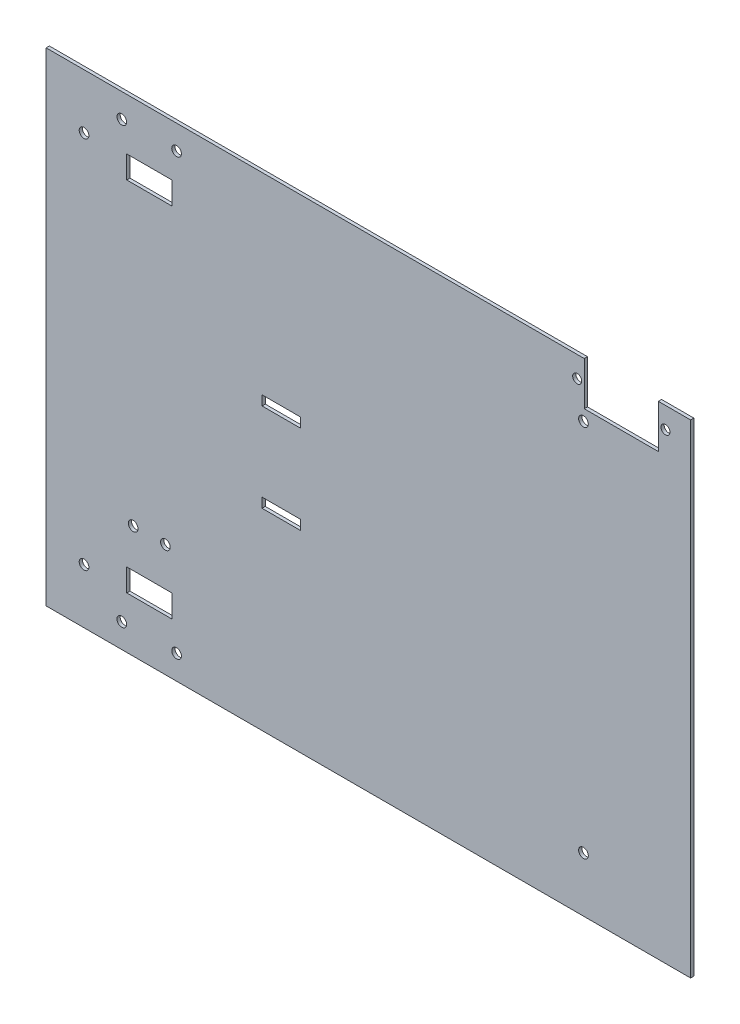
ISO-10303-21;
HEADER;
FILE_DESCRIPTION(('STEP AP214'),'2;1');
FILE_NAME('part.step','',(''),(''),'','','');
FILE_SCHEMA(('AUTOMOTIVE_DESIGN { 1 0 10303 214 1 1 1 1 }'));
ENDSEC;
DATA;
#1=APPLICATION_CONTEXT('core data for automotive mechanical design processes');
#2=APPLICATION_PROTOCOL_DEFINITION('international standard','automotive_design',2000,#1);
#3=PRODUCT_CONTEXT('',#1,'mechanical');
#4=PRODUCT('Part','Part','',(#3));
#5=PRODUCT_RELATED_PRODUCT_CATEGORY('part','',(#4));
#6=PRODUCT_DEFINITION_FORMATION('','',#4);
#7=PRODUCT_DEFINITION_CONTEXT('part definition',#1,'design');
#8=PRODUCT_DEFINITION('design','',#6,#7);
#9=PRODUCT_DEFINITION_SHAPE('','',#8);
#10=(LENGTH_UNIT() NAMED_UNIT(*) SI_UNIT(.MILLI.,.METRE.));
#11=(NAMED_UNIT(*) PLANE_ANGLE_UNIT() SI_UNIT($,.RADIAN.));
#12=(NAMED_UNIT(*) SI_UNIT($,.STERADIAN.) SOLID_ANGLE_UNIT());
#13=UNCERTAINTY_MEASURE_WITH_UNIT(LENGTH_MEASURE(1.E-05),#10,'distance_accuracy_value','');
#14=(GEOMETRIC_REPRESENTATION_CONTEXT(3) GLOBAL_UNCERTAINTY_ASSIGNED_CONTEXT((#13)) GLOBAL_UNIT_ASSIGNED_CONTEXT((#10,
#11,#12)) REPRESENTATION_CONTEXT('',''));
#15=CARTESIAN_POINT('',(0.,0.,0.));
#16=DIRECTION('',(0.,0.,1.));
#17=DIRECTION('',(1.,0.,0.));
#18=AXIS2_PLACEMENT_3D('',#15,#16,#17);
#19=CARTESIAN_POINT('',(-100.,75.,1.));
#20=DIRECTION('',(0.,-1.,0.));
#21=DIRECTION('',(0.,0.,-1.));
#22=AXIS2_PLACEMENT_3D('',#19,#20,#21);
#23=PLANE('',#22);
#24=DIRECTION('',(-1.,0.,0.));
#25=VECTOR('',#24,1.);
#26=CARTESIAN_POINT('',(-100.,75.,1.));
#27=LINE('',#26,#25);
#28=CARTESIAN_POINT('',(67.,75.,1.));
#29=VERTEX_POINT('',#28);
#30=CARTESIAN_POINT('',(-100.,75.,1.));
#31=VERTEX_POINT('',#30);
#32=EDGE_CURVE('E421',#29,#31,#27,.T.);
#33=ORIENTED_EDGE('',*,*,#32,.F.);
#34=DIRECTION('',(0.,0.,1.));
#35=VECTOR('',#34,1.);
#36=CARTESIAN_POINT('',(67.,75.,0.));
#37=LINE('',#36,#35);
#38=CARTESIAN_POINT('',(67.,75.,0.));
#39=VERTEX_POINT('',#38);
#40=EDGE_CURVE('E228',#39,#29,#37,.T.);
#41=ORIENTED_EDGE('',*,*,#40,.F.);
#42=DIRECTION('',(-1.,0.,0.));
#43=VECTOR('',#42,1.);
#44=CARTESIAN_POINT('',(-100.,75.,0.));
#45=LINE('',#44,#43);
#46=CARTESIAN_POINT('',(-100.,75.,0.));
#47=VERTEX_POINT('',#46);
#48=EDGE_CURVE('E433',#39,#47,#45,.T.);
#49=ORIENTED_EDGE('',*,*,#48,.T.);
#50=DIRECTION('',(0.,0.,-1.));
#51=VECTOR('',#50,1.);
#52=CARTESIAN_POINT('',(-100.,75.,1.));
#53=LINE('',#52,#51);
#54=EDGE_CURVE('E41',#31,#47,#53,.T.);
#55=ORIENTED_EDGE('',*,*,#54,.F.);
#56=EDGE_LOOP('',(#33,#41,#49,#55));
#57=FACE_BOUND('',#56,.T.);
#58=ADVANCED_FACE('F33',(#57),#23,.F.);
#59=CARTESIAN_POINT('',(100.,75.,1.));
#60=DIRECTION('',(-1.,0.,0.));
#61=DIRECTION('',(0.,-1.,0.));
#62=AXIS2_PLACEMENT_3D('',#59,#60,#61);
#63=PLANE('',#62);
#64=DIRECTION('',(0.,1.,0.));
#65=VECTOR('',#64,1.);
#66=CARTESIAN_POINT('',(100.,75.,0.));
#67=LINE('',#66,#65);
#68=CARTESIAN_POINT('',(100.,-75.,0.));
#69=VERTEX_POINT('',#68);
#70=CARTESIAN_POINT('',(100.,75.,0.));
#71=VERTEX_POINT('',#70);
#72=EDGE_CURVE('E411',#69,#71,#67,.T.);
#73=ORIENTED_EDGE('',*,*,#72,.T.);
#74=DIRECTION('',(0.,0.,-1.));
#75=VECTOR('',#74,1.);
#76=CARTESIAN_POINT('',(100.,75.,1.));
#77=LINE('',#76,#75);
#78=CARTESIAN_POINT('',(100.,75.,1.));
#79=VERTEX_POINT('',#78);
#80=EDGE_CURVE('E11',#79,#71,#77,.T.);
#81=ORIENTED_EDGE('',*,*,#80,.F.);
#82=DIRECTION('',(0.,1.,0.));
#83=VECTOR('',#82,1.);
#84=CARTESIAN_POINT('',(100.,75.,1.));
#85=LINE('',#84,#83);
#86=CARTESIAN_POINT('',(100.,-75.,1.));
#87=VERTEX_POINT('',#86);
#88=EDGE_CURVE('E418',#87,#79,#85,.T.);
#89=ORIENTED_EDGE('',*,*,#88,.F.);
#90=DIRECTION('',(0.,0.,-1.));
#91=VECTOR('',#90,1.);
#92=CARTESIAN_POINT('',(100.,-75.,1.));
#93=LINE('',#92,#91);
#94=EDGE_CURVE('E430',#87,#69,#93,.T.);
#95=ORIENTED_EDGE('',*,*,#94,.T.);
#96=EDGE_LOOP('',(#73,#81,#89,#95));
#97=FACE_BOUND('',#96,.T.);
#98=ADVANCED_FACE('F35',(#97),#63,.F.);
#99=CARTESIAN_POINT('',(90.,75.,0.));
#100=VERTEX_POINT('',#99);
#101=EDGE_CURVE('E434',#71,#100,#45,.T.);
#102=ORIENTED_EDGE('',*,*,#101,.T.);
#103=DIRECTION('',(0.,0.,1.));
#104=VECTOR('',#103,1.);
#105=CARTESIAN_POINT('',(90.,75.,0.));
#106=LINE('',#105,#104);
#107=CARTESIAN_POINT('',(90.,75.,1.));
#108=VERTEX_POINT('',#107);
#109=EDGE_CURVE('E258',#100,#108,#106,.T.);
#110=ORIENTED_EDGE('',*,*,#109,.T.);
#111=EDGE_CURVE('E423',#79,#108,#27,.T.);
#112=ORIENTED_EDGE('',*,*,#111,.F.);
#113=ORIENTED_EDGE('',*,*,#80,.T.);
#114=EDGE_LOOP('',(#102,#110,#112,#113));
#115=FACE_BOUND('',#114,.T.);
#116=ADVANCED_FACE('F480',(#115),#23,.F.);
#117=CARTESIAN_POINT('',(-100.,75.,1.));
#118=DIRECTION('',(1.,0.,0.));
#119=DIRECTION('',(0.,1.,0.));
#120=AXIS2_PLACEMENT_3D('',#117,#118,#119);
#121=PLANE('',#120);
#122=DIRECTION('',(0.,-1.,0.));
#123=VECTOR('',#122,1.);
#124=CARTESIAN_POINT('',(-100.,75.,0.));
#125=LINE('',#124,#123);
#126=CARTESIAN_POINT('',(-99.9999999999999,-75.,0.));
#127=VERTEX_POINT('',#126);
#128=EDGE_CURVE('E437',#47,#127,#125,.T.);
#129=ORIENTED_EDGE('',*,*,#128,.T.);
#130=DIRECTION('',(0.,0.,-1.));
#131=VECTOR('',#130,1.);
#132=CARTESIAN_POINT('',(-99.9999999999999,-75.,1.));
#133=LINE('',#132,#131);
#134=CARTESIAN_POINT('',(-99.9999999999999,-75.,1.));
#135=VERTEX_POINT('',#134);
#136=EDGE_CURVE('E442',#135,#127,#133,.T.);
#137=ORIENTED_EDGE('',*,*,#136,.F.);
#138=DIRECTION('',(0.,-1.,0.));
#139=VECTOR('',#138,1.);
#140=CARTESIAN_POINT('',(-100.,75.,1.));
#141=LINE('',#140,#139);
#142=EDGE_CURVE('E426',#31,#135,#141,.T.);
#143=ORIENTED_EDGE('',*,*,#142,.F.);
#144=ORIENTED_EDGE('',*,*,#54,.T.);
#145=EDGE_LOOP('',(#129,#137,#143,#144));
#146=FACE_BOUND('',#145,.T.);
#147=ADVANCED_FACE('F449',(#146),#121,.F.);
#148=CARTESIAN_POINT('',(-99.9999999999999,-75.,1.));
#149=DIRECTION('',(0.,1.,0.));
#150=DIRECTION('',(0.,0.,1.));
#151=AXIS2_PLACEMENT_3D('',#148,#149,#150);
#152=PLANE('',#151);
#153=DIRECTION('',(1.,0.,0.));
#154=VECTOR('',#153,1.);
#155=CARTESIAN_POINT('',(-99.9999999999999,-75.,0.));
#156=LINE('',#155,#154);
#157=EDGE_CURVE('E422',#127,#69,#156,.T.);
#158=ORIENTED_EDGE('',*,*,#157,.T.);
#159=ORIENTED_EDGE('',*,*,#94,.F.);
#160=DIRECTION('',(1.,0.,0.));
#161=VECTOR('',#160,1.);
#162=CARTESIAN_POINT('',(-99.9999999999999,-75.,1.));
#163=LINE('',#162,#161);
#164=EDGE_CURVE('E428',#135,#87,#163,.T.);
#165=ORIENTED_EDGE('',*,*,#164,.F.);
#166=ORIENTED_EDGE('',*,*,#136,.T.);
#167=EDGE_LOOP('',(#158,#159,#165,#166));
#168=FACE_BOUND('',#167,.T.);
#169=ADVANCED_FACE('F459',(#168),#152,.F.);
#170=CARTESIAN_POINT('',(0.,0.,1.));
#171=DIRECTION('',(0.,0.,1.));
#172=DIRECTION('',(1.,0.,0.));
#173=AXIS2_PLACEMENT_3D('',#170,#171,#172);
#174=PLANE('',#173);
#175=CARTESIAN_POINT('',(-88.2534675197417,-58.,1.));
#176=DIRECTION('',(0.,0.,1.));
#177=DIRECTION('',(1.,0.,0.));
#178=AXIS2_PLACEMENT_3D('',#175,#176,#177);
#179=CIRCLE('',#178,1.5);
#180=CARTESIAN_POINT('',(-86.7534675197417,-58.,1.));
#181=VERTEX_POINT('',#180);
#182=EDGE_CURVE('E267',#181,#181,#179,.T.);
#183=ORIENTED_EDGE('',*,*,#182,.F.);
#184=EDGE_LOOP('',(#183));
#185=FACE_BOUND('',#184,.T.);
#186=CARTESIAN_POINT('',(-63.,-40.,1.));
#187=DIRECTION('',(0.,0.,1.));
#188=DIRECTION('',(1.,0.,0.));
#189=AXIS2_PLACEMENT_3D('',#186,#187,#188);
#190=CIRCLE('',#189,1.5);
#191=CARTESIAN_POINT('',(-61.5,-40.,1.));
#192=VERTEX_POINT('',#191);
#193=EDGE_CURVE('E354',#192,#192,#190,.T.);
#194=ORIENTED_EDGE('',*,*,#193,.F.);
#195=EDGE_LOOP('',(#194));
#196=FACE_BOUND('',#195,.T.);
#197=DIRECTION('',(0.,-1.,0.));
#198=VECTOR('',#197,1.);
#199=CARTESIAN_POINT('',(-75.,59.,1.));
#200=LINE('',#199,#198);
#201=CARTESIAN_POINT('',(-75.,59.,1.));
#202=VERTEX_POINT('',#201);
#203=CARTESIAN_POINT('',(-75.,52.,1.));
#204=VERTEX_POINT('',#203);
#205=EDGE_CURVE('E48',#202,#204,#200,.T.);
#206=ORIENTED_EDGE('',*,*,#205,.F.);
#207=DIRECTION('',(-1.,0.,0.));
#208=VECTOR('',#207,1.);
#209=CARTESIAN_POINT('',(-75.,59.,1.));
#210=LINE('',#209,#208);
#211=CARTESIAN_POINT('',(-61.,59.,1.));
#212=VERTEX_POINT('',#211);
#213=EDGE_CURVE('E326',#212,#202,#210,.T.);
#214=ORIENTED_EDGE('',*,*,#213,.F.);
#215=DIRECTION('',(0.,1.,0.));
#216=VECTOR('',#215,1.);
#217=CARTESIAN_POINT('',(-61.,59.,1.));
#218=LINE('',#217,#216);
#219=CARTESIAN_POINT('',(-61.,52.,1.));
#220=VERTEX_POINT('',#219);
#221=EDGE_CURVE('E341',#220,#212,#218,.T.);
#222=ORIENTED_EDGE('',*,*,#221,.F.);
#223=DIRECTION('',(1.,0.,0.));
#224=VECTOR('',#223,1.);
#225=CARTESIAN_POINT('',(-75.,52.,1.));
#226=LINE('',#225,#224);
#227=EDGE_CURVE('E337',#204,#220,#226,.T.);
#228=ORIENTED_EDGE('',*,*,#227,.F.);
#229=EDGE_LOOP('',(#206,#214,#222,#228));
#230=FACE_BOUND('',#229,.T.);
#231=CARTESIAN_POINT('',(-76.53,67.5,1.));
#232=DIRECTION('',(0.,0.,1.));
#233=DIRECTION('',(-1.,0.,0.));
#234=AXIS2_PLACEMENT_3D('',#231,#232,#233);
#235=CIRCLE('',#234,1.5);
#236=CARTESIAN_POINT('',(-78.03,67.5,1.));
#237=VERTEX_POINT('',#236);
#238=EDGE_CURVE('E318',#237,#237,#235,.T.);
#239=ORIENTED_EDGE('',*,*,#238,.F.);
#240=EDGE_LOOP('',(#239));
#241=FACE_BOUND('',#240,.T.);
#242=CARTESIAN_POINT('',(-59.53,67.5,1.));
#243=DIRECTION('',(0.,0.,1.));
#244=DIRECTION('',(-1.,0.,0.));
#245=AXIS2_PLACEMENT_3D('',#242,#243,#244);
#246=CIRCLE('',#245,1.5);
#247=CARTESIAN_POINT('',(-61.03,67.5,1.));
#248=VERTEX_POINT('',#247);
#249=EDGE_CURVE('E317',#248,#248,#246,.T.);
#250=ORIENTED_EDGE('',*,*,#249,.F.);
#251=EDGE_LOOP('',(#250));
#252=FACE_BOUND('',#251,.T.);
#253=CARTESIAN_POINT('',(-73.,-40.,1.));
#254=DIRECTION('',(0.,0.,1.));
#255=DIRECTION('',(1.,0.,0.));
#256=AXIS2_PLACEMENT_3D('',#253,#254,#255);
#257=CIRCLE('',#256,1.5);
#258=CARTESIAN_POINT('',(-71.5,-40.,1.));
#259=VERTEX_POINT('',#258);
#260=EDGE_CURVE('E378',#259,#259,#257,.T.);
#261=ORIENTED_EDGE('',*,*,#260,.F.);
#262=EDGE_LOOP('',(#261));
#263=FACE_BOUND('',#262,.T.);
#264=CARTESIAN_POINT('',(-59.53,-67.5,1.));
#265=DIRECTION('',(0.,0.,1.));
#266=DIRECTION('',(1.,0.,0.));
#267=AXIS2_PLACEMENT_3D('',#264,#265,#266);
#268=CIRCLE('',#267,1.5);
#269=CARTESIAN_POINT('',(-58.03,-67.5,1.));
#270=VERTEX_POINT('',#269);
#271=EDGE_CURVE('E372',#270,#270,#268,.T.);
#272=ORIENTED_EDGE('',*,*,#271,.F.);
#273=EDGE_LOOP('',(#272));
#274=FACE_BOUND('',#273,.T.);
#275=CARTESIAN_POINT('',(-76.53,-67.5,1.));
#276=DIRECTION('',(0.,0.,1.));
#277=DIRECTION('',(1.,0.,0.));
#278=AXIS2_PLACEMENT_3D('',#275,#276,#277);
#279=CIRCLE('',#278,1.5);
#280=CARTESIAN_POINT('',(-75.03,-67.5,1.));
#281=VERTEX_POINT('',#280);
#282=EDGE_CURVE('E366',#281,#281,#279,.T.);
#283=ORIENTED_EDGE('',*,*,#282,.F.);
#284=EDGE_LOOP('',(#283));
#285=FACE_BOUND('',#284,.T.);
#286=DIRECTION('',(0.,-1.,0.));
#287=VECTOR('',#286,1.);
#288=CARTESIAN_POINT('',(-33.,15.25,1.));
#289=LINE('',#288,#287);
#290=CARTESIAN_POINT('',(-33.,15.25,1.));
#291=VERTEX_POINT('',#290);
#292=CARTESIAN_POINT('',(-33.,12.25,1.));
#293=VERTEX_POINT('',#292);
#294=EDGE_CURVE('E56',#291,#293,#289,.T.);
#295=ORIENTED_EDGE('',*,*,#294,.F.);
#296=DIRECTION('',(-1.,0.,0.));
#297=VECTOR('',#296,1.);
#298=CARTESIAN_POINT('',(-33.,15.25,1.));
#299=LINE('',#298,#297);
#300=CARTESIAN_POINT('',(-21.,15.25,1.));
#301=VERTEX_POINT('',#300);
#302=EDGE_CURVE('E215',#301,#291,#299,.T.);
#303=ORIENTED_EDGE('',*,*,#302,.F.);
#304=DIRECTION('',(0.,1.,0.));
#305=VECTOR('',#304,1.);
#306=CARTESIAN_POINT('',(-21.,15.25,1.));
#307=LINE('',#306,#305);
#308=CARTESIAN_POINT('',(-21.,12.25,1.));
#309=VERTEX_POINT('',#308);
#310=EDGE_CURVE('E218',#309,#301,#307,.T.);
#311=ORIENTED_EDGE('',*,*,#310,.F.);
#312=DIRECTION('',(1.,0.,0.));
#313=VECTOR('',#312,1.);
#314=CARTESIAN_POINT('',(-33.,12.25,1.));
#315=LINE('',#314,#313);
#316=EDGE_CURVE('E227',#293,#309,#315,.T.);
#317=ORIENTED_EDGE('',*,*,#316,.F.);
#318=EDGE_LOOP('',(#295,#303,#311,#317));
#319=FACE_BOUND('',#318,.T.);
#320=DIRECTION('',(0.,-1.,0.));
#321=VECTOR('',#320,1.);
#322=CARTESIAN_POINT('',(67.,75.,1.));
#323=LINE('',#322,#321);
#324=CARTESIAN_POINT('',(67.,61.5,1.));
#325=VERTEX_POINT('',#324);
#326=EDGE_CURVE('E249',#29,#325,#323,.T.);
#327=ORIENTED_EDGE('',*,*,#326,.F.);
#328=ORIENTED_EDGE('',*,*,#32,.T.);
#329=ORIENTED_EDGE('',*,*,#142,.T.);
#330=ORIENTED_EDGE('',*,*,#164,.T.);
#331=ORIENTED_EDGE('',*,*,#88,.T.);
#332=ORIENTED_EDGE('',*,*,#111,.T.);
#333=DIRECTION('',(0.,1.,0.));
#334=VECTOR('',#333,1.);
#335=CARTESIAN_POINT('',(90.,75.,1.));
#336=LINE('',#335,#334);
#337=CARTESIAN_POINT('',(90.,61.5,1.));
#338=VERTEX_POINT('',#337);
#339=EDGE_CURVE('E242',#338,#108,#336,.T.);
#340=ORIENTED_EDGE('',*,*,#339,.F.);
#341=DIRECTION('',(1.,0.,0.));
#342=VECTOR('',#341,1.);
#343=CARTESIAN_POINT('',(67.,61.5,1.));
#344=LINE('',#343,#342);
#345=EDGE_CURVE('E252',#325,#338,#344,.T.);
#346=ORIENTED_EDGE('',*,*,#345,.F.);
#347=EDGE_LOOP('',(#327,#328,#329,#330,#331,#332,#340,#346));
#348=FACE_BOUND('',#347,.T.);
#349=CARTESIAN_POINT('',(64.8,68.5,1.));
#350=DIRECTION('',(0.,0.,1.));
#351=DIRECTION('',(1.,0.,0.));
#352=AXIS2_PLACEMENT_3D('',#349,#350,#351);
#353=CIRCLE('',#352,1.4);
#354=CARTESIAN_POINT('',(66.2,68.5,1.));
#355=VERTEX_POINT('',#354);
#356=EDGE_CURVE('E882',#355,#355,#353,.T.);
#357=ORIENTED_EDGE('',*,*,#356,.F.);
#358=EDGE_LOOP('',(#357));
#359=FACE_BOUND('',#358,.T.);
#360=CARTESIAN_POINT('',(92.2,68.5,1.));
#361=DIRECTION('',(0.,0.,1.));
#362=DIRECTION('',(1.,0.,0.));
#363=AXIS2_PLACEMENT_3D('',#360,#361,#362);
#364=CIRCLE('',#363,1.4);
#365=CARTESIAN_POINT('',(93.6,68.5,1.));
#366=VERTEX_POINT('',#365);
#367=EDGE_CURVE('E221',#366,#366,#364,.T.);
#368=ORIENTED_EDGE('',*,*,#367,.F.);
#369=EDGE_LOOP('',(#368));
#370=FACE_BOUND('',#369,.T.);
#371=DIRECTION('',(0.,-1.,0.));
#372=VECTOR('',#371,1.);
#373=CARTESIAN_POINT('',(-33.,-15.25,1.));
#374=LINE('',#373,#372);
#375=CARTESIAN_POINT('',(-33.,-12.25,1.));
#376=VERTEX_POINT('',#375);
#377=CARTESIAN_POINT('',(-33.,-15.25,1.));
#378=VERTEX_POINT('',#377);
#379=EDGE_CURVE('E234',#376,#378,#374,.T.);
#380=ORIENTED_EDGE('',*,*,#379,.F.);
#381=DIRECTION('',(-1.,0.,0.));
#382=VECTOR('',#381,1.);
#383=CARTESIAN_POINT('',(-33.,-12.25,1.));
#384=LINE('',#383,#382);
#385=CARTESIAN_POINT('',(-21.,-12.25,1.));
#386=VERTEX_POINT('',#385);
#387=EDGE_CURVE('E288',#386,#376,#384,.T.);
#388=ORIENTED_EDGE('',*,*,#387,.F.);
#389=DIRECTION('',(0.,1.,0.));
#390=VECTOR('',#389,1.);
#391=CARTESIAN_POINT('',(-21.,-15.25,1.));
#392=LINE('',#391,#390);
#393=CARTESIAN_POINT('',(-21.,-15.25,1.));
#394=VERTEX_POINT('',#393);
#395=EDGE_CURVE('E302',#394,#386,#392,.T.);
#396=ORIENTED_EDGE('',*,*,#395,.F.);
#397=DIRECTION('',(1.,0.,0.));
#398=VECTOR('',#397,1.);
#399=CARTESIAN_POINT('',(-33.,-15.25,1.));
#400=LINE('',#399,#398);
#401=EDGE_CURVE('E299',#378,#394,#400,.T.);
#402=ORIENTED_EDGE('',*,*,#401,.F.);
#403=EDGE_LOOP('',(#380,#388,#396,#402));
#404=FACE_BOUND('',#403,.T.);
#405=CARTESIAN_POINT('',(-88.2534675197417,58.,1.));
#406=DIRECTION('',(0.,0.,1.));
#407=DIRECTION('',(-1.,0.,0.));
#408=AXIS2_PLACEMENT_3D('',#405,#406,#407);
#409=CIRCLE('',#408,1.5);
#410=CARTESIAN_POINT('',(-89.7534675197417,58.,1.));
#411=VERTEX_POINT('',#410);
#412=EDGE_CURVE('E280',#411,#411,#409,.T.);
#413=ORIENTED_EDGE('',*,*,#412,.F.);
#414=EDGE_LOOP('',(#413));
#415=FACE_BOUND('',#414,.T.);
#416=CARTESIAN_POINT('',(66.7465324802583,58.,1.));
#417=DIRECTION('',(0.,0.,1.));
#418=DIRECTION('',(-1.,0.,0.));
#419=AXIS2_PLACEMENT_3D('',#416,#417,#418);
#420=CIRCLE('',#419,1.5);
#421=CARTESIAN_POINT('',(65.2465324802583,58.,1.));
#422=VERTEX_POINT('',#421);
#423=EDGE_CURVE('E274',#422,#422,#420,.T.);
#424=ORIENTED_EDGE('',*,*,#423,.F.);
#425=EDGE_LOOP('',(#424));
#426=FACE_BOUND('',#425,.T.);
#427=CARTESIAN_POINT('',(66.7465324802583,-58.,1.));
#428=DIRECTION('',(0.,0.,1.));
#429=DIRECTION('',(1.,0.,0.));
#430=AXIS2_PLACEMENT_3D('',#427,#428,#429);
#431=CIRCLE('',#430,1.5);
#432=CARTESIAN_POINT('',(68.2465324802583,-58.,1.));
#433=VERTEX_POINT('',#432);
#434=EDGE_CURVE('E268',#433,#433,#431,.T.);
#435=ORIENTED_EDGE('',*,*,#434,.F.);
#436=EDGE_LOOP('',(#435));
#437=FACE_BOUND('',#436,.T.);
#438=DIRECTION('',(0.,-1.,0.));
#439=VECTOR('',#438,1.);
#440=CARTESIAN_POINT('',(-75.,-59.,1.));
#441=LINE('',#440,#439);
#442=CARTESIAN_POINT('',(-75.,-52.,1.));
#443=VERTEX_POINT('',#442);
#444=CARTESIAN_POINT('',(-75.,-59.,1.));
#445=VERTEX_POINT('',#444);
#446=EDGE_CURVE('E365',#443,#445,#441,.T.);
#447=ORIENTED_EDGE('',*,*,#446,.F.);
#448=DIRECTION('',(-1.,0.,0.));
#449=VECTOR('',#448,1.);
#450=CARTESIAN_POINT('',(-75.,-52.,1.));
#451=LINE('',#450,#449);
#452=CARTESIAN_POINT('',(-61.,-52.,1.));
#453=VERTEX_POINT('',#452);
#454=EDGE_CURVE('E390',#453,#443,#451,.T.);
#455=ORIENTED_EDGE('',*,*,#454,.F.);
#456=DIRECTION('',(0.,1.,0.));
#457=VECTOR('',#456,1.);
#458=CARTESIAN_POINT('',(-61.,-59.,1.));
#459=LINE('',#458,#457);
#460=CARTESIAN_POINT('',(-61.,-59.,1.));
#461=VERTEX_POINT('',#460);
#462=EDGE_CURVE('E404',#461,#453,#459,.T.);
#463=ORIENTED_EDGE('',*,*,#462,.F.);
#464=DIRECTION('',(1.,0.,0.));
#465=VECTOR('',#464,1.);
#466=CARTESIAN_POINT('',(-75.,-59.,1.));
#467=LINE('',#466,#465);
#468=EDGE_CURVE('E401',#445,#461,#467,.T.);
#469=ORIENTED_EDGE('',*,*,#468,.F.);
#470=EDGE_LOOP('',(#447,#455,#463,#469));
#471=FACE_BOUND('',#470,.T.);
#472=ADVANCED_FACE('F466',(#185,#196,#230,#241,#252,#263,#274,#285,#319,#348,#359,#370,#404,
#415,#426,#437,#471),#174,.T.);
#473=CARTESIAN_POINT('',(0.,0.,0.));
#474=DIRECTION('',(0.,0.,1.));
#475=DIRECTION('',(1.,0.,0.));
#476=AXIS2_PLACEMENT_3D('',#473,#474,#475);
#477=PLANE('',#476);
#478=CARTESIAN_POINT('',(-88.2534675197417,-58.,0.));
#479=DIRECTION('',(0.,0.,1.));
#480=DIRECTION('',(1.,0.,0.));
#481=AXIS2_PLACEMENT_3D('',#478,#479,#480);
#482=CIRCLE('',#481,1.5);
#483=CARTESIAN_POINT('',(-86.7534675197417,-58.,0.));
#484=VERTEX_POINT('',#483);
#485=EDGE_CURVE('E357',#484,#484,#482,.T.);
#486=ORIENTED_EDGE('',*,*,#485,.T.);
#487=EDGE_LOOP('',(#486));
#488=FACE_BOUND('',#487,.T.);
#489=CARTESIAN_POINT('',(-63.,-40.,0.));
#490=DIRECTION('',(0.,0.,1.));
#491=DIRECTION('',(1.,0.,0.));
#492=AXIS2_PLACEMENT_3D('',#489,#490,#491);
#493=CIRCLE('',#492,1.5);
#494=CARTESIAN_POINT('',(-61.5,-40.,0.));
#495=VERTEX_POINT('',#494);
#496=EDGE_CURVE('E338',#495,#495,#493,.T.);
#497=ORIENTED_EDGE('',*,*,#496,.T.);
#498=EDGE_LOOP('',(#497));
#499=FACE_BOUND('',#498,.T.);
#500=DIRECTION('',(-1.,0.,0.));
#501=VECTOR('',#500,1.);
#502=CARTESIAN_POINT('',(-75.,59.,0.));
#503=LINE('',#502,#501);
#504=CARTESIAN_POINT('',(-61.,59.,0.));
#505=VERTEX_POINT('',#504);
#506=CARTESIAN_POINT('',(-75.,59.,0.));
#507=VERTEX_POINT('',#506);
#508=EDGE_CURVE('E332',#505,#507,#503,.T.);
#509=ORIENTED_EDGE('',*,*,#508,.T.);
#510=DIRECTION('',(0.,-1.,0.));
#511=VECTOR('',#510,1.);
#512=CARTESIAN_POINT('',(-75.,59.,0.));
#513=LINE('',#512,#511);
#514=CARTESIAN_POINT('',(-75.,52.,0.));
#515=VERTEX_POINT('',#514);
#516=EDGE_CURVE('E322',#507,#515,#513,.T.);
#517=ORIENTED_EDGE('',*,*,#516,.T.);
#518=DIRECTION('',(1.,0.,0.));
#519=VECTOR('',#518,1.);
#520=CARTESIAN_POINT('',(-75.,52.,0.));
#521=LINE('',#520,#519);
#522=CARTESIAN_POINT('',(-61.,52.,0.));
#523=VERTEX_POINT('',#522);
#524=EDGE_CURVE('E325',#515,#523,#521,.T.);
#525=ORIENTED_EDGE('',*,*,#524,.T.);
#526=DIRECTION('',(0.,1.,0.));
#527=VECTOR('',#526,1.);
#528=CARTESIAN_POINT('',(-61.,59.,0.));
#529=LINE('',#528,#527);
#530=EDGE_CURVE('E329',#523,#505,#529,.T.);
#531=ORIENTED_EDGE('',*,*,#530,.T.);
#532=EDGE_LOOP('',(#509,#517,#525,#531));
#533=FACE_BOUND('',#532,.T.);
#534=CARTESIAN_POINT('',(-76.53,67.5,0.));
#535=DIRECTION('',(0.,0.,1.));
#536=DIRECTION('',(-1.,0.,0.));
#537=AXIS2_PLACEMENT_3D('',#534,#535,#536);
#538=CIRCLE('',#537,1.5);
#539=CARTESIAN_POINT('',(-78.03,67.5,0.));
#540=VERTEX_POINT('',#539);
#541=EDGE_CURVE('E314',#540,#540,#538,.T.);
#542=ORIENTED_EDGE('',*,*,#541,.T.);
#543=EDGE_LOOP('',(#542));
#544=FACE_BOUND('',#543,.T.);
#545=CARTESIAN_POINT('',(-59.53,67.5,0.));
#546=DIRECTION('',(0.,0.,1.));
#547=DIRECTION('',(-1.,0.,0.));
#548=AXIS2_PLACEMENT_3D('',#545,#546,#547);
#549=CIRCLE('',#548,1.5);
#550=CARTESIAN_POINT('',(-61.03,67.5,0.));
#551=VERTEX_POINT('',#550);
#552=EDGE_CURVE('E381',#551,#551,#549,.T.);
#553=ORIENTED_EDGE('',*,*,#552,.T.);
#554=EDGE_LOOP('',(#553));
#555=FACE_BOUND('',#554,.T.);
#556=CARTESIAN_POINT('',(-73.,-40.,0.));
#557=DIRECTION('',(0.,0.,1.));
#558=DIRECTION('',(1.,0.,0.));
#559=AXIS2_PLACEMENT_3D('',#556,#557,#558);
#560=CIRCLE('',#559,1.5);
#561=CARTESIAN_POINT('',(-71.5,-40.,0.));
#562=VERTEX_POINT('',#561);
#563=EDGE_CURVE('E375',#562,#562,#560,.T.);
#564=ORIENTED_EDGE('',*,*,#563,.T.);
#565=EDGE_LOOP('',(#564));
#566=FACE_BOUND('',#565,.T.);
#567=CARTESIAN_POINT('',(-59.53,-67.5,0.));
#568=DIRECTION('',(0.,0.,1.));
#569=DIRECTION('',(1.,0.,0.));
#570=AXIS2_PLACEMENT_3D('',#567,#568,#569);
#571=CIRCLE('',#570,1.5);
#572=CARTESIAN_POINT('',(-58.03,-67.5,0.));
#573=VERTEX_POINT('',#572);
#574=EDGE_CURVE('E369',#573,#573,#571,.T.);
#575=ORIENTED_EDGE('',*,*,#574,.T.);
#576=EDGE_LOOP('',(#575));
#577=FACE_BOUND('',#576,.T.);
#578=CARTESIAN_POINT('',(-76.53,-67.5,0.));
#579=DIRECTION('',(0.,0.,1.));
#580=DIRECTION('',(1.,0.,0.));
#581=AXIS2_PLACEMENT_3D('',#578,#579,#580);
#582=CIRCLE('',#581,1.5);
#583=CARTESIAN_POINT('',(-75.03,-67.5,0.));
#584=VERTEX_POINT('',#583);
#585=EDGE_CURVE('E362',#584,#584,#582,.T.);
#586=ORIENTED_EDGE('',*,*,#585,.T.);
#587=EDGE_LOOP('',(#586));
#588=FACE_BOUND('',#587,.T.);
#589=DIRECTION('',(-1.,0.,0.));
#590=VECTOR('',#589,1.);
#591=CARTESIAN_POINT('',(-33.,15.25,0.));
#592=LINE('',#591,#590);
#593=CARTESIAN_POINT('',(-21.,15.25,0.));
#594=VERTEX_POINT('',#593);
#595=CARTESIAN_POINT('',(-33.,15.25,0.));
#596=VERTEX_POINT('',#595);
#597=EDGE_CURVE('E202',#594,#596,#592,.T.);
#598=ORIENTED_EDGE('',*,*,#597,.T.);
#599=DIRECTION('',(0.,-1.,0.));
#600=VECTOR('',#599,1.);
#601=CARTESIAN_POINT('',(-33.,15.25,0.));
#602=LINE('',#601,#600);
#603=CARTESIAN_POINT('',(-33.,12.25,0.));
#604=VERTEX_POINT('',#603);
#605=EDGE_CURVE('E196',#596,#604,#602,.T.);
#606=ORIENTED_EDGE('',*,*,#605,.T.);
#607=DIRECTION('',(1.,0.,0.));
#608=VECTOR('',#607,1.);
#609=CARTESIAN_POINT('',(-33.,12.25,0.));
#610=LINE('',#609,#608);
#611=CARTESIAN_POINT('',(-21.,12.25,0.));
#612=VERTEX_POINT('',#611);
#613=EDGE_CURVE('E206',#604,#612,#610,.T.);
#614=ORIENTED_EDGE('',*,*,#613,.T.);
#615=DIRECTION('',(0.,1.,0.));
#616=VECTOR('',#615,1.);
#617=CARTESIAN_POINT('',(-21.,15.25,0.));
#618=LINE('',#617,#616);
#619=EDGE_CURVE('E210',#612,#594,#618,.T.);
#620=ORIENTED_EDGE('',*,*,#619,.T.);
#621=EDGE_LOOP('',(#598,#606,#614,#620));
#622=FACE_BOUND('',#621,.T.);
#623=ORIENTED_EDGE('',*,*,#48,.F.);
#624=DIRECTION('',(0.,-1.,0.));
#625=VECTOR('',#624,1.);
#626=CARTESIAN_POINT('',(67.,75.,0.));
#627=LINE('',#626,#625);
#628=CARTESIAN_POINT('',(67.,61.5,0.));
#629=VERTEX_POINT('',#628);
#630=EDGE_CURVE('E238',#39,#629,#627,.T.);
#631=ORIENTED_EDGE('',*,*,#630,.T.);
#632=DIRECTION('',(1.,0.,0.));
#633=VECTOR('',#632,1.);
#634=CARTESIAN_POINT('',(67.,61.5,0.));
#635=LINE('',#634,#633);
#636=CARTESIAN_POINT('',(90.,61.5,0.));
#637=VERTEX_POINT('',#636);
#638=EDGE_CURVE('E241',#629,#637,#635,.T.);
#639=ORIENTED_EDGE('',*,*,#638,.T.);
#640=DIRECTION('',(0.,1.,0.));
#641=VECTOR('',#640,1.);
#642=CARTESIAN_POINT('',(90.,75.,0.));
#643=LINE('',#642,#641);
#644=EDGE_CURVE('E245',#637,#100,#643,.T.);
#645=ORIENTED_EDGE('',*,*,#644,.T.);
#646=ORIENTED_EDGE('',*,*,#101,.F.);
#647=ORIENTED_EDGE('',*,*,#72,.F.);
#648=ORIENTED_EDGE('',*,*,#157,.F.);
#649=ORIENTED_EDGE('',*,*,#128,.F.);
#650=EDGE_LOOP('',(#623,#631,#639,#645,#646,#647,#648,#649));
#651=FACE_BOUND('',#650,.T.);
#652=CARTESIAN_POINT('',(64.8,68.5,0.));
#653=DIRECTION('',(0.,0.,1.));
#654=DIRECTION('',(1.,0.,0.));
#655=AXIS2_PLACEMENT_3D('',#652,#653,#654);
#656=CIRCLE('',#655,1.4);
#657=CARTESIAN_POINT('',(66.2,68.5,0.));
#658=VERTEX_POINT('',#657);
#659=EDGE_CURVE('E253',#658,#658,#656,.T.);
#660=ORIENTED_EDGE('',*,*,#659,.T.);
#661=EDGE_LOOP('',(#660));
#662=FACE_BOUND('',#661,.T.);
#663=CARTESIAN_POINT('',(92.2,68.5,0.));
#664=DIRECTION('',(0.,0.,1.));
#665=DIRECTION('',(1.,0.,0.));
#666=AXIS2_PLACEMENT_3D('',#663,#664,#665);
#667=CIRCLE('',#666,1.4);
#668=CARTESIAN_POINT('',(93.6,68.5,0.));
#669=VERTEX_POINT('',#668);
#670=EDGE_CURVE('E883',#669,#669,#667,.T.);
#671=ORIENTED_EDGE('',*,*,#670,.T.);
#672=EDGE_LOOP('',(#671));
#673=FACE_BOUND('',#672,.T.);
#674=DIRECTION('',(-1.,0.,0.));
#675=VECTOR('',#674,1.);
#676=CARTESIAN_POINT('',(-33.,-12.25,0.));
#677=LINE('',#676,#675);
#678=CARTESIAN_POINT('',(-21.,-12.25,0.));
#679=VERTEX_POINT('',#678);
#680=CARTESIAN_POINT('',(-33.,-12.25,0.));
#681=VERTEX_POINT('',#680);
#682=EDGE_CURVE('E294',#679,#681,#677,.T.);
#683=ORIENTED_EDGE('',*,*,#682,.T.);
#684=DIRECTION('',(0.,-1.,0.));
#685=VECTOR('',#684,1.);
#686=CARTESIAN_POINT('',(-33.,-15.25,0.));
#687=LINE('',#686,#685);
#688=CARTESIAN_POINT('',(-33.,-15.25,0.));
#689=VERTEX_POINT('',#688);
#690=EDGE_CURVE('E284',#681,#689,#687,.T.);
#691=ORIENTED_EDGE('',*,*,#690,.T.);
#692=DIRECTION('',(1.,0.,0.));
#693=VECTOR('',#692,1.);
#694=CARTESIAN_POINT('',(-33.,-15.25,0.));
#695=LINE('',#694,#693);
#696=CARTESIAN_POINT('',(-21.,-15.25,0.));
#697=VERTEX_POINT('',#696);
#698=EDGE_CURVE('E287',#689,#697,#695,.T.);
#699=ORIENTED_EDGE('',*,*,#698,.T.);
#700=DIRECTION('',(0.,1.,0.));
#701=VECTOR('',#700,1.);
#702=CARTESIAN_POINT('',(-21.,-15.25,0.));
#703=LINE('',#702,#701);
#704=EDGE_CURVE('E291',#697,#679,#703,.T.);
#705=ORIENTED_EDGE('',*,*,#704,.T.);
#706=EDGE_LOOP('',(#683,#691,#699,#705));
#707=FACE_BOUND('',#706,.T.);
#708=CARTESIAN_POINT('',(-88.2534675197417,58.,0.));
#709=DIRECTION('',(0.,0.,1.));
#710=DIRECTION('',(-1.,0.,0.));
#711=AXIS2_PLACEMENT_3D('',#708,#709,#710);
#712=CIRCLE('',#711,1.5);
#713=CARTESIAN_POINT('',(-89.7534675197417,58.,0.));
#714=VERTEX_POINT('',#713);
#715=EDGE_CURVE('E277',#714,#714,#712,.T.);
#716=ORIENTED_EDGE('',*,*,#715,.T.);
#717=EDGE_LOOP('',(#716));
#718=FACE_BOUND('',#717,.T.);
#719=CARTESIAN_POINT('',(66.7465324802583,58.,0.));
#720=DIRECTION('',(0.,0.,1.));
#721=DIRECTION('',(-1.,0.,0.));
#722=AXIS2_PLACEMENT_3D('',#719,#720,#721);
#723=CIRCLE('',#722,1.5);
#724=CARTESIAN_POINT('',(65.2465324802583,58.,0.));
#725=VERTEX_POINT('',#724);
#726=EDGE_CURVE('E271',#725,#725,#723,.T.);
#727=ORIENTED_EDGE('',*,*,#726,.T.);
#728=EDGE_LOOP('',(#727));
#729=FACE_BOUND('',#728,.T.);
#730=CARTESIAN_POINT('',(66.7465324802583,-58.,0.));
#731=DIRECTION('',(0.,0.,1.));
#732=DIRECTION('',(1.,0.,0.));
#733=AXIS2_PLACEMENT_3D('',#730,#731,#732);
#734=CIRCLE('',#733,1.5);
#735=CARTESIAN_POINT('',(68.2465324802583,-58.,0.));
#736=VERTEX_POINT('',#735);
#737=EDGE_CURVE('E264',#736,#736,#734,.T.);
#738=ORIENTED_EDGE('',*,*,#737,.T.);
#739=EDGE_LOOP('',(#738));
#740=FACE_BOUND('',#739,.T.);
#741=DIRECTION('',(-1.,0.,0.));
#742=VECTOR('',#741,1.);
#743=CARTESIAN_POINT('',(-75.,-52.,0.));
#744=LINE('',#743,#742);
#745=CARTESIAN_POINT('',(-61.,-52.,0.));
#746=VERTEX_POINT('',#745);
#747=CARTESIAN_POINT('',(-75.,-52.,0.));
#748=VERTEX_POINT('',#747);
#749=EDGE_CURVE('E396',#746,#748,#744,.T.);
#750=ORIENTED_EDGE('',*,*,#749,.T.);
#751=DIRECTION('',(0.,-1.,0.));
#752=VECTOR('',#751,1.);
#753=CARTESIAN_POINT('',(-75.,-59.,0.));
#754=LINE('',#753,#752);
#755=CARTESIAN_POINT('',(-75.,-59.,0.));
#756=VERTEX_POINT('',#755);
#757=EDGE_CURVE('E386',#748,#756,#754,.T.);
#758=ORIENTED_EDGE('',*,*,#757,.T.);
#759=DIRECTION('',(1.,0.,0.));
#760=VECTOR('',#759,1.);
#761=CARTESIAN_POINT('',(-75.,-59.,0.));
#762=LINE('',#761,#760);
#763=CARTESIAN_POINT('',(-61.,-59.,0.));
#764=VERTEX_POINT('',#763);
#765=EDGE_CURVE('E389',#756,#764,#762,.T.);
#766=ORIENTED_EDGE('',*,*,#765,.T.);
#767=DIRECTION('',(0.,1.,0.));
#768=VECTOR('',#767,1.);
#769=CARTESIAN_POINT('',(-61.,-59.,0.));
#770=LINE('',#769,#768);
#771=EDGE_CURVE('E393',#764,#746,#770,.T.);
#772=ORIENTED_EDGE('',*,*,#771,.T.);
#773=EDGE_LOOP('',(#750,#758,#766,#772));
#774=FACE_BOUND('',#773,.T.);
#775=ADVANCED_FACE('F212',(#488,#499,#533,#544,#555,#566,#577,#588,#622,#651,#662,#673,#707,
#718,#729,#740,#774),#477,.F.);
#776=CARTESIAN_POINT('',(-75.,-59.,0.));
#777=DIRECTION('',(-1.,0.,0.));
#778=DIRECTION('',(0.,0.,1.));
#779=AXIS2_PLACEMENT_3D('',#776,#777,#778);
#780=PLANE('',#779);
#781=ORIENTED_EDGE('',*,*,#446,.T.);
#782=DIRECTION('',(0.,0.,1.));
#783=VECTOR('',#782,1.);
#784=CARTESIAN_POINT('',(-75.,-59.,0.));
#785=LINE('',#784,#783);
#786=EDGE_CURVE('E399',#756,#445,#785,.T.);
#787=ORIENTED_EDGE('',*,*,#786,.F.);
#788=ORIENTED_EDGE('',*,*,#757,.F.);
#789=DIRECTION('',(0.,0.,1.));
#790=VECTOR('',#789,1.);
#791=CARTESIAN_POINT('',(-75.,-52.,0.));
#792=LINE('',#791,#790);
#793=EDGE_CURVE('E409',#748,#443,#792,.T.);
#794=ORIENTED_EDGE('',*,*,#793,.T.);
#795=EDGE_LOOP('',(#781,#787,#788,#794));
#796=FACE_BOUND('',#795,.T.);
#797=ADVANCED_FACE('F524',(#796),#780,.F.);
#798=CARTESIAN_POINT('',(-75.,-52.,0.));
#799=DIRECTION('',(0.,1.,0.));
#800=DIRECTION('',(0.,0.,1.));
#801=AXIS2_PLACEMENT_3D('',#798,#799,#800);
#802=PLANE('',#801);
#803=ORIENTED_EDGE('',*,*,#454,.T.);
#804=ORIENTED_EDGE('',*,*,#793,.F.);
#805=ORIENTED_EDGE('',*,*,#749,.F.);
#806=DIRECTION('',(0.,0.,1.));
#807=VECTOR('',#806,1.);
#808=CARTESIAN_POINT('',(-61.,-52.,0.));
#809=LINE('',#808,#807);
#810=EDGE_CURVE('E412',#746,#453,#809,.T.);
#811=ORIENTED_EDGE('',*,*,#810,.T.);
#812=EDGE_LOOP('',(#803,#804,#805,#811));
#813=FACE_BOUND('',#812,.T.);
#814=ADVANCED_FACE('F532',(#813),#802,.F.);
#815=CARTESIAN_POINT('',(-61.,-59.,0.));
#816=DIRECTION('',(1.,0.,0.));
#817=DIRECTION('',(0.,0.,-1.));
#818=AXIS2_PLACEMENT_3D('',#815,#816,#817);
#819=PLANE('',#818);
#820=ORIENTED_EDGE('',*,*,#462,.T.);
#821=ORIENTED_EDGE('',*,*,#810,.F.);
#822=ORIENTED_EDGE('',*,*,#771,.F.);
#823=DIRECTION('',(0.,0.,1.));
#824=VECTOR('',#823,1.);
#825=CARTESIAN_POINT('',(-61.,-59.,0.));
#826=LINE('',#825,#824);
#827=EDGE_CURVE('E414',#764,#461,#826,.T.);
#828=ORIENTED_EDGE('',*,*,#827,.T.);
#829=EDGE_LOOP('',(#820,#821,#822,#828));
#830=FACE_BOUND('',#829,.T.);
#831=ADVANCED_FACE('F540',(#830),#819,.F.);
#832=CARTESIAN_POINT('',(-75.,-59.,0.));
#833=DIRECTION('',(0.,-1.,0.));
#834=DIRECTION('',(1.,0.,0.));
#835=AXIS2_PLACEMENT_3D('',#832,#833,#834);
#836=PLANE('',#835);
#837=ORIENTED_EDGE('',*,*,#468,.T.);
#838=ORIENTED_EDGE('',*,*,#827,.F.);
#839=ORIENTED_EDGE('',*,*,#765,.F.);
#840=ORIENTED_EDGE('',*,*,#786,.T.);
#841=EDGE_LOOP('',(#837,#838,#839,#840));
#842=FACE_BOUND('',#841,.T.);
#843=ADVANCED_FACE('F548',(#842),#836,.F.);
#844=CARTESIAN_POINT('',(66.7465324802583,-58.,0.));
#845=DIRECTION('',(0.,0.,1.));
#846=DIRECTION('',(1.,0.,0.));
#847=AXIS2_PLACEMENT_3D('',#844,#845,#846);
#848=CYLINDRICAL_SURFACE('',#847,1.5);
#849=ORIENTED_EDGE('',*,*,#737,.F.);
#850=EDGE_LOOP('',(#849));
#851=FACE_BOUND('',#850,.T.);
#852=ORIENTED_EDGE('',*,*,#434,.T.);
#853=EDGE_LOOP('',(#852));
#854=FACE_BOUND('',#853,.T.);
#855=ADVANCED_FACE('F556',(#851,#854),#848,.F.);
#856=CARTESIAN_POINT('',(66.7465324802583,58.,0.));
#857=DIRECTION('',(0.,0.,1.));
#858=DIRECTION('',(1.,0.,0.));
#859=AXIS2_PLACEMENT_3D('',#856,#857,#858);
#860=CYLINDRICAL_SURFACE('',#859,1.5);
#861=ORIENTED_EDGE('',*,*,#726,.F.);
#862=EDGE_LOOP('',(#861));
#863=FACE_BOUND('',#862,.T.);
#864=ORIENTED_EDGE('',*,*,#423,.T.);
#865=EDGE_LOOP('',(#864));
#866=FACE_BOUND('',#865,.T.);
#867=ADVANCED_FACE('F564',(#863,#866),#860,.F.);
#868=CARTESIAN_POINT('',(-88.2534675197417,58.,0.));
#869=DIRECTION('',(0.,0.,1.));
#870=DIRECTION('',(1.,0.,0.));
#871=AXIS2_PLACEMENT_3D('',#868,#869,#870);
#872=CYLINDRICAL_SURFACE('',#871,1.5);
#873=ORIENTED_EDGE('',*,*,#715,.F.);
#874=EDGE_LOOP('',(#873));
#875=FACE_BOUND('',#874,.T.);
#876=ORIENTED_EDGE('',*,*,#412,.T.);
#877=EDGE_LOOP('',(#876));
#878=FACE_BOUND('',#877,.T.);
#879=ADVANCED_FACE('F572',(#875,#878),#872,.F.);
#880=CARTESIAN_POINT('',(-33.,-15.25,0.));
#881=DIRECTION('',(-1.,0.,0.));
#882=DIRECTION('',(0.,0.,1.));
#883=AXIS2_PLACEMENT_3D('',#880,#881,#882);
#884=PLANE('',#883);
#885=ORIENTED_EDGE('',*,*,#379,.T.);
#886=DIRECTION('',(0.,0.,1.));
#887=VECTOR('',#886,1.);
#888=CARTESIAN_POINT('',(-33.,-15.25,0.));
#889=LINE('',#888,#887);
#890=EDGE_CURVE('E297',#689,#378,#889,.T.);
#891=ORIENTED_EDGE('',*,*,#890,.F.);
#892=ORIENTED_EDGE('',*,*,#690,.F.);
#893=DIRECTION('',(0.,0.,1.));
#894=VECTOR('',#893,1.);
#895=CARTESIAN_POINT('',(-33.,-12.25,0.));
#896=LINE('',#895,#894);
#897=EDGE_CURVE('E283',#681,#376,#896,.T.);
#898=ORIENTED_EDGE('',*,*,#897,.T.);
#899=EDGE_LOOP('',(#885,#891,#892,#898));
#900=FACE_BOUND('',#899,.T.);
#901=ADVANCED_FACE('F580',(#900),#884,.F.);
#902=CARTESIAN_POINT('',(-33.,-12.25,0.));
#903=DIRECTION('',(0.,1.,0.));
#904=DIRECTION('',(0.,0.,1.));
#905=AXIS2_PLACEMENT_3D('',#902,#903,#904);
#906=PLANE('',#905);
#907=ORIENTED_EDGE('',*,*,#387,.T.);
#908=ORIENTED_EDGE('',*,*,#897,.F.);
#909=ORIENTED_EDGE('',*,*,#682,.F.);
#910=DIRECTION('',(0.,0.,1.));
#911=VECTOR('',#910,1.);
#912=CARTESIAN_POINT('',(-21.,-12.25,0.));
#913=LINE('',#912,#911);
#914=EDGE_CURVE('E308',#679,#386,#913,.T.);
#915=ORIENTED_EDGE('',*,*,#914,.T.);
#916=EDGE_LOOP('',(#907,#908,#909,#915));
#917=FACE_BOUND('',#916,.T.);
#918=ADVANCED_FACE('F588',(#917),#906,.F.);
#919=CARTESIAN_POINT('',(-21.,-15.25,0.));
#920=DIRECTION('',(1.,0.,0.));
#921=DIRECTION('',(0.,0.,-1.));
#922=AXIS2_PLACEMENT_3D('',#919,#920,#921);
#923=PLANE('',#922);
#924=ORIENTED_EDGE('',*,*,#395,.T.);
#925=ORIENTED_EDGE('',*,*,#914,.F.);
#926=ORIENTED_EDGE('',*,*,#704,.F.);
#927=DIRECTION('',(0.,0.,1.));
#928=VECTOR('',#927,1.);
#929=CARTESIAN_POINT('',(-21.,-15.25,0.));
#930=LINE('',#929,#928);
#931=EDGE_CURVE('E310',#697,#394,#930,.T.);
#932=ORIENTED_EDGE('',*,*,#931,.T.);
#933=EDGE_LOOP('',(#924,#925,#926,#932));
#934=FACE_BOUND('',#933,.T.);
#935=ADVANCED_FACE('F596',(#934),#923,.F.);
#936=CARTESIAN_POINT('',(-33.,-15.25,0.));
#937=DIRECTION('',(0.,-1.,0.));
#938=DIRECTION('',(0.,0.,-1.));
#939=AXIS2_PLACEMENT_3D('',#936,#937,#938);
#940=PLANE('',#939);
#941=ORIENTED_EDGE('',*,*,#401,.T.);
#942=ORIENTED_EDGE('',*,*,#931,.F.);
#943=ORIENTED_EDGE('',*,*,#698,.F.);
#944=ORIENTED_EDGE('',*,*,#890,.T.);
#945=EDGE_LOOP('',(#941,#942,#943,#944));
#946=FACE_BOUND('',#945,.T.);
#947=ADVANCED_FACE('F604',(#946),#940,.F.);
#948=CARTESIAN_POINT('',(92.2,68.5,0.));
#949=DIRECTION('',(0.,0.,1.));
#950=DIRECTION('',(1.,0.,0.));
#951=AXIS2_PLACEMENT_3D('',#948,#949,#950);
#952=CYLINDRICAL_SURFACE('',#951,1.4);
#953=ORIENTED_EDGE('',*,*,#670,.F.);
#954=EDGE_LOOP('',(#953));
#955=FACE_BOUND('',#954,.T.);
#956=ORIENTED_EDGE('',*,*,#367,.T.);
#957=EDGE_LOOP('',(#956));
#958=FACE_BOUND('',#957,.T.);
#959=ADVANCED_FACE('F612',(#955,#958),#952,.F.);
#960=CARTESIAN_POINT('',(64.8,68.5,0.));
#961=DIRECTION('',(0.,0.,1.));
#962=DIRECTION('',(1.,0.,0.));
#963=AXIS2_PLACEMENT_3D('',#960,#961,#962);
#964=CYLINDRICAL_SURFACE('',#963,1.4);
#965=ORIENTED_EDGE('',*,*,#659,.F.);
#966=EDGE_LOOP('',(#965));
#967=FACE_BOUND('',#966,.T.);
#968=ORIENTED_EDGE('',*,*,#356,.T.);
#969=EDGE_LOOP('',(#968));
#970=FACE_BOUND('',#969,.T.);
#971=ADVANCED_FACE('F620',(#967,#970),#964,.F.);
#972=CARTESIAN_POINT('',(67.,75.,0.));
#973=DIRECTION('',(-1.,0.,0.));
#974=DIRECTION('',(0.,0.,1.));
#975=AXIS2_PLACEMENT_3D('',#972,#973,#974);
#976=PLANE('',#975);
#977=ORIENTED_EDGE('',*,*,#326,.T.);
#978=DIRECTION('',(0.,0.,1.));
#979=VECTOR('',#978,1.);
#980=CARTESIAN_POINT('',(67.,61.5,0.));
#981=LINE('',#980,#979);
#982=EDGE_CURVE('E248',#629,#325,#981,.T.);
#983=ORIENTED_EDGE('',*,*,#982,.F.);
#984=ORIENTED_EDGE('',*,*,#630,.F.);
#985=ORIENTED_EDGE('',*,*,#40,.T.);
#986=EDGE_LOOP('',(#977,#983,#984,#985));
#987=FACE_BOUND('',#986,.T.);
#988=ADVANCED_FACE('F472',(#987),#976,.F.);
#989=CARTESIAN_POINT('',(90.,75.,0.));
#990=DIRECTION('',(1.,0.,0.));
#991=DIRECTION('',(0.,0.,-1.));
#992=AXIS2_PLACEMENT_3D('',#989,#990,#991);
#993=PLANE('',#992);
#994=ORIENTED_EDGE('',*,*,#339,.T.);
#995=ORIENTED_EDGE('',*,*,#109,.F.);
#996=ORIENTED_EDGE('',*,*,#644,.F.);
#997=DIRECTION('',(0.,0.,1.));
#998=VECTOR('',#997,1.);
#999=CARTESIAN_POINT('',(90.,61.5,0.));
#1000=LINE('',#999,#998);
#1001=EDGE_CURVE('E261',#637,#338,#1000,.T.);
#1002=ORIENTED_EDGE('',*,*,#1001,.T.);
#1003=EDGE_LOOP('',(#994,#995,#996,#1002));
#1004=FACE_BOUND('',#1003,.T.);
#1005=ADVANCED_FACE('F478',(#1004),#993,.F.);
#1006=CARTESIAN_POINT('',(67.,61.5,0.));
#1007=DIRECTION('',(0.,-1.,0.));
#1008=DIRECTION('',(1.,0.,0.));
#1009=AXIS2_PLACEMENT_3D('',#1006,#1007,#1008);
#1010=PLANE('',#1009);
#1011=ORIENTED_EDGE('',*,*,#345,.T.);
#1012=ORIENTED_EDGE('',*,*,#1001,.F.);
#1013=ORIENTED_EDGE('',*,*,#638,.F.);
#1014=ORIENTED_EDGE('',*,*,#982,.T.);
#1015=EDGE_LOOP('',(#1011,#1012,#1013,#1014));
#1016=FACE_BOUND('',#1015,.T.);
#1017=ADVANCED_FACE('F476',(#1016),#1010,.F.);
#1018=CARTESIAN_POINT('',(-33.,15.25,0.));
#1019=DIRECTION('',(-1.,0.,0.));
#1020=DIRECTION('',(0.,0.,1.));
#1021=AXIS2_PLACEMENT_3D('',#1018,#1019,#1020);
#1022=PLANE('',#1021);
#1023=ORIENTED_EDGE('',*,*,#294,.T.);
#1024=DIRECTION('',(0.,0.,1.));
#1025=VECTOR('',#1024,1.);
#1026=CARTESIAN_POINT('',(-33.,12.25,0.));
#1027=LINE('',#1026,#1025);
#1028=EDGE_CURVE('E192',#604,#293,#1027,.T.);
#1029=ORIENTED_EDGE('',*,*,#1028,.F.);
#1030=ORIENTED_EDGE('',*,*,#605,.F.);
#1031=DIRECTION('',(0.,0.,1.));
#1032=VECTOR('',#1031,1.);
#1033=CARTESIAN_POINT('',(-33.,15.25,0.));
#1034=LINE('',#1033,#1032);
#1035=EDGE_CURVE('E232',#596,#291,#1034,.T.);
#1036=ORIENTED_EDGE('',*,*,#1035,.T.);
#1037=EDGE_LOOP('',(#1023,#1029,#1030,#1036));
#1038=FACE_BOUND('',#1037,.T.);
#1039=ADVANCED_FACE('F194',(#1038),#1022,.F.);
#1040=CARTESIAN_POINT('',(-33.,15.25,0.));
#1041=DIRECTION('',(0.,1.,0.));
#1042=DIRECTION('',(0.,0.,1.));
#1043=AXIS2_PLACEMENT_3D('',#1040,#1041,#1042);
#1044=PLANE('',#1043);
#1045=ORIENTED_EDGE('',*,*,#302,.T.);
#1046=ORIENTED_EDGE('',*,*,#1035,.F.);
#1047=ORIENTED_EDGE('',*,*,#597,.F.);
#1048=DIRECTION('',(0.,0.,1.));
#1049=VECTOR('',#1048,1.);
#1050=CARTESIAN_POINT('',(-21.,15.25,0.));
#1051=LINE('',#1050,#1049);
#1052=EDGE_CURVE('E235',#594,#301,#1051,.T.);
#1053=ORIENTED_EDGE('',*,*,#1052,.T.);
#1054=EDGE_LOOP('',(#1045,#1046,#1047,#1053));
#1055=FACE_BOUND('',#1054,.T.);
#1056=ADVANCED_FACE('F653',(#1055),#1044,.F.);
#1057=CARTESIAN_POINT('',(-21.,15.25,0.));
#1058=DIRECTION('',(1.,0.,0.));
#1059=DIRECTION('',(0.,0.,-1.));
#1060=AXIS2_PLACEMENT_3D('',#1057,#1058,#1059);
#1061=PLANE('',#1060);
#1062=ORIENTED_EDGE('',*,*,#310,.T.);
#1063=ORIENTED_EDGE('',*,*,#1052,.F.);
#1064=ORIENTED_EDGE('',*,*,#619,.F.);
#1065=DIRECTION('',(0.,0.,1.));
#1066=VECTOR('',#1065,1.);
#1067=CARTESIAN_POINT('',(-21.,12.25,0.));
#1068=LINE('',#1067,#1066);
#1069=EDGE_CURVE('E201',#612,#309,#1068,.T.);
#1070=ORIENTED_EDGE('',*,*,#1069,.T.);
#1071=EDGE_LOOP('',(#1062,#1063,#1064,#1070));
#1072=FACE_BOUND('',#1071,.T.);
#1073=ADVANCED_FACE('F660',(#1072),#1061,.F.);
#1074=CARTESIAN_POINT('',(-33.,12.25,0.));
#1075=DIRECTION('',(0.,-1.,0.));
#1076=DIRECTION('',(0.,0.,-1.));
#1077=AXIS2_PLACEMENT_3D('',#1074,#1075,#1076);
#1078=PLANE('',#1077);
#1079=ORIENTED_EDGE('',*,*,#316,.T.);
#1080=ORIENTED_EDGE('',*,*,#1069,.F.);
#1081=ORIENTED_EDGE('',*,*,#613,.F.);
#1082=ORIENTED_EDGE('',*,*,#1028,.T.);
#1083=EDGE_LOOP('',(#1079,#1080,#1081,#1082));
#1084=FACE_BOUND('',#1083,.T.);
#1085=ADVANCED_FACE('F207',(#1084),#1078,.F.);
#1086=CARTESIAN_POINT('',(-76.53,-67.5,0.));
#1087=DIRECTION('',(0.,0.,1.));
#1088=DIRECTION('',(1.,0.,0.));
#1089=AXIS2_PLACEMENT_3D('',#1086,#1087,#1088);
#1090=CYLINDRICAL_SURFACE('',#1089,1.5);
#1091=ORIENTED_EDGE('',*,*,#585,.F.);
#1092=EDGE_LOOP('',(#1091));
#1093=FACE_BOUND('',#1092,.T.);
#1094=ORIENTED_EDGE('',*,*,#282,.T.);
#1095=EDGE_LOOP('',(#1094));
#1096=FACE_BOUND('',#1095,.T.);
#1097=ADVANCED_FACE('F675',(#1093,#1096),#1090,.F.);
#1098=CARTESIAN_POINT('',(-59.53,-67.5,0.));
#1099=DIRECTION('',(0.,0.,1.));
#1100=DIRECTION('',(1.,0.,0.));
#1101=AXIS2_PLACEMENT_3D('',#1098,#1099,#1100);
#1102=CYLINDRICAL_SURFACE('',#1101,1.5);
#1103=ORIENTED_EDGE('',*,*,#574,.F.);
#1104=EDGE_LOOP('',(#1103));
#1105=FACE_BOUND('',#1104,.T.);
#1106=ORIENTED_EDGE('',*,*,#271,.T.);
#1107=EDGE_LOOP('',(#1106));
#1108=FACE_BOUND('',#1107,.T.);
#1109=ADVANCED_FACE('F682',(#1105,#1108),#1102,.F.);
#1110=CARTESIAN_POINT('',(-73.,-40.,0.));
#1111=DIRECTION('',(0.,0.,1.));
#1112=DIRECTION('',(1.,0.,0.));
#1113=AXIS2_PLACEMENT_3D('',#1110,#1111,#1112);
#1114=CYLINDRICAL_SURFACE('',#1113,1.5);
#1115=ORIENTED_EDGE('',*,*,#563,.F.);
#1116=EDGE_LOOP('',(#1115));
#1117=FACE_BOUND('',#1116,.T.);
#1118=ORIENTED_EDGE('',*,*,#260,.T.);
#1119=EDGE_LOOP('',(#1118));
#1120=FACE_BOUND('',#1119,.T.);
#1121=ADVANCED_FACE('F690',(#1117,#1120),#1114,.F.);
#1122=CARTESIAN_POINT('',(-59.53,67.5,0.));
#1123=DIRECTION('',(0.,0.,1.));
#1124=DIRECTION('',(1.,0.,0.));
#1125=AXIS2_PLACEMENT_3D('',#1122,#1123,#1124);
#1126=CYLINDRICAL_SURFACE('',#1125,1.5);
#1127=ORIENTED_EDGE('',*,*,#552,.F.);
#1128=EDGE_LOOP('',(#1127));
#1129=FACE_BOUND('',#1128,.T.);
#1130=ORIENTED_EDGE('',*,*,#249,.T.);
#1131=EDGE_LOOP('',(#1130));
#1132=FACE_BOUND('',#1131,.T.);
#1133=ADVANCED_FACE('F698',(#1129,#1132),#1126,.F.);
#1134=CARTESIAN_POINT('',(-76.53,67.5,0.));
#1135=DIRECTION('',(0.,0.,1.));
#1136=DIRECTION('',(1.,0.,0.));
#1137=AXIS2_PLACEMENT_3D('',#1134,#1135,#1136);
#1138=CYLINDRICAL_SURFACE('',#1137,1.5);
#1139=ORIENTED_EDGE('',*,*,#541,.F.);
#1140=EDGE_LOOP('',(#1139));
#1141=FACE_BOUND('',#1140,.T.);
#1142=ORIENTED_EDGE('',*,*,#238,.T.);
#1143=EDGE_LOOP('',(#1142));
#1144=FACE_BOUND('',#1143,.T.);
#1145=ADVANCED_FACE('F706',(#1141,#1144),#1138,.F.);
#1146=CARTESIAN_POINT('',(-75.,59.,0.));
#1147=DIRECTION('',(-1.,0.,0.));
#1148=DIRECTION('',(0.,0.,1.));
#1149=AXIS2_PLACEMENT_3D('',#1146,#1147,#1148);
#1150=PLANE('',#1149);
#1151=ORIENTED_EDGE('',*,*,#205,.T.);
#1152=DIRECTION('',(0.,0.,1.));
#1153=VECTOR('',#1152,1.);
#1154=CARTESIAN_POINT('',(-75.,52.,0.));
#1155=LINE('',#1154,#1153);
#1156=EDGE_CURVE('E335',#515,#204,#1155,.T.);
#1157=ORIENTED_EDGE('',*,*,#1156,.F.);
#1158=ORIENTED_EDGE('',*,*,#516,.F.);
#1159=DIRECTION('',(0.,0.,1.));
#1160=VECTOR('',#1159,1.);
#1161=CARTESIAN_POINT('',(-75.,59.,0.));
#1162=LINE('',#1161,#1160);
#1163=EDGE_CURVE('E321',#507,#202,#1162,.T.);
#1164=ORIENTED_EDGE('',*,*,#1163,.T.);
#1165=EDGE_LOOP('',(#1151,#1157,#1158,#1164));
#1166=FACE_BOUND('',#1165,.T.);
#1167=ADVANCED_FACE('F714',(#1166),#1150,.F.);
#1168=CARTESIAN_POINT('',(-75.,59.,0.));
#1169=DIRECTION('',(0.,1.,0.));
#1170=DIRECTION('',(-1.,0.,0.));
#1171=AXIS2_PLACEMENT_3D('',#1168,#1169,#1170);
#1172=PLANE('',#1171);
#1173=ORIENTED_EDGE('',*,*,#213,.T.);
#1174=ORIENTED_EDGE('',*,*,#1163,.F.);
#1175=ORIENTED_EDGE('',*,*,#508,.F.);
#1176=DIRECTION('',(0.,0.,1.));
#1177=VECTOR('',#1176,1.);
#1178=CARTESIAN_POINT('',(-61.,59.,0.));
#1179=LINE('',#1178,#1177);
#1180=EDGE_CURVE('E347',#505,#212,#1179,.T.);
#1181=ORIENTED_EDGE('',*,*,#1180,.T.);
#1182=EDGE_LOOP('',(#1173,#1174,#1175,#1181));
#1183=FACE_BOUND('',#1182,.T.);
#1184=ADVANCED_FACE('F722',(#1183),#1172,.F.);
#1185=CARTESIAN_POINT('',(-61.,59.,0.));
#1186=DIRECTION('',(1.,0.,0.));
#1187=DIRECTION('',(0.,0.,-1.));
#1188=AXIS2_PLACEMENT_3D('',#1185,#1186,#1187);
#1189=PLANE('',#1188);
#1190=ORIENTED_EDGE('',*,*,#221,.T.);
#1191=ORIENTED_EDGE('',*,*,#1180,.F.);
#1192=ORIENTED_EDGE('',*,*,#530,.F.);
#1193=DIRECTION('',(0.,0.,1.));
#1194=VECTOR('',#1193,1.);
#1195=CARTESIAN_POINT('',(-61.,52.,0.));
#1196=LINE('',#1195,#1194);
#1197=EDGE_CURVE('E349',#523,#220,#1196,.T.);
#1198=ORIENTED_EDGE('',*,*,#1197,.T.);
#1199=EDGE_LOOP('',(#1190,#1191,#1192,#1198));
#1200=FACE_BOUND('',#1199,.T.);
#1201=ADVANCED_FACE('F729',(#1200),#1189,.F.);
#1202=CARTESIAN_POINT('',(-75.,52.,0.));
#1203=DIRECTION('',(0.,-1.,0.));
#1204=DIRECTION('',(0.,0.,-1.));
#1205=AXIS2_PLACEMENT_3D('',#1202,#1203,#1204);
#1206=PLANE('',#1205);
#1207=ORIENTED_EDGE('',*,*,#227,.T.);
#1208=ORIENTED_EDGE('',*,*,#1197,.F.);
#1209=ORIENTED_EDGE('',*,*,#524,.F.);
#1210=ORIENTED_EDGE('',*,*,#1156,.T.);
#1211=EDGE_LOOP('',(#1207,#1208,#1209,#1210));
#1212=FACE_BOUND('',#1211,.T.);
#1213=ADVANCED_FACE('F737',(#1212),#1206,.F.);
#1214=CARTESIAN_POINT('',(-63.,-40.,0.));
#1215=DIRECTION('',(0.,0.,1.));
#1216=DIRECTION('',(1.,0.,0.));
#1217=AXIS2_PLACEMENT_3D('',#1214,#1215,#1216);
#1218=CYLINDRICAL_SURFACE('',#1217,1.5);
#1219=ORIENTED_EDGE('',*,*,#496,.F.);
#1220=EDGE_LOOP('',(#1219));
#1221=FACE_BOUND('',#1220,.T.);
#1222=ORIENTED_EDGE('',*,*,#193,.T.);
#1223=EDGE_LOOP('',(#1222));
#1224=FACE_BOUND('',#1223,.T.);
#1225=ADVANCED_FACE('F745',(#1221,#1224),#1218,.F.);
#1226=CARTESIAN_POINT('',(-88.2534675197417,-58.,0.));
#1227=DIRECTION('',(0.,0.,1.));
#1228=DIRECTION('',(1.,0.,0.));
#1229=AXIS2_PLACEMENT_3D('',#1226,#1227,#1228);
#1230=CYLINDRICAL_SURFACE('',#1229,1.5);
#1231=ORIENTED_EDGE('',*,*,#485,.F.);
#1232=EDGE_LOOP('',(#1231));
#1233=FACE_BOUND('',#1232,.T.);
#1234=ORIENTED_EDGE('',*,*,#182,.T.);
#1235=EDGE_LOOP('',(#1234));
#1236=FACE_BOUND('',#1235,.T.);
#1237=ADVANCED_FACE('F753',(#1233,#1236),#1230,.F.);
#1238=CLOSED_SHELL('',(#58,#98,#116,#147,#169,#472,#775,#797,#814,#831,#843,#855,#867,#879,#901,
#918,#935,#947,#959,#971,#988,#1005,#1017,#1039,#1056,#1073,#1085,#1097,#1109,#1121,#1133,#1145,
#1167,#1184,#1201,#1213,#1225,#1237));
#1239=MANIFOLD_SOLID_BREP('B2',#1238);
#1240=ADVANCED_BREP_SHAPE_REPRESENTATION('',(#18,#1239),#14);
#1241=SHAPE_DEFINITION_REPRESENTATION(#9,#1240);
ENDSEC;
END-ISO-10303-21;
